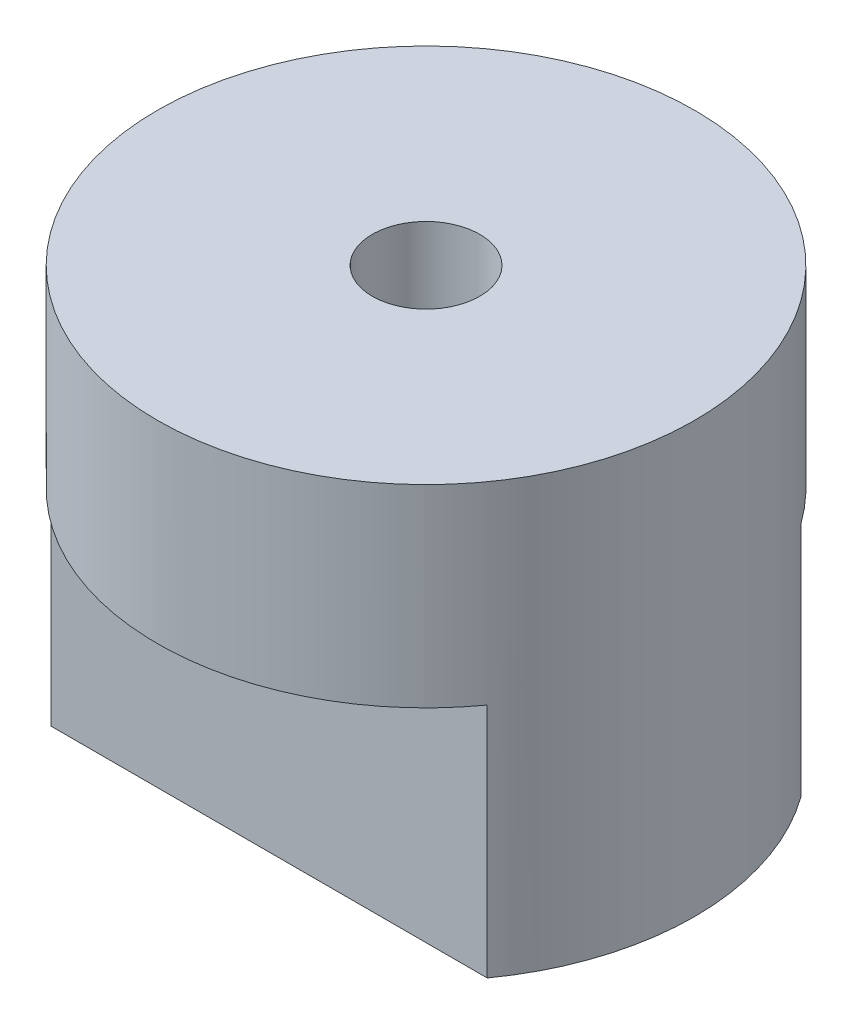
ISO-10303-21;
HEADER;
FILE_DESCRIPTION(('STEP AP214'),'2;1');
FILE_NAME('part.step','',(''),(''),'','','');
FILE_SCHEMA(('AUTOMOTIVE_DESIGN { 1 0 10303 214 1 1 1 1 }'));
ENDSEC;
DATA;
#1=APPLICATION_CONTEXT('core data for automotive mechanical design processes');
#2=APPLICATION_PROTOCOL_DEFINITION('international standard','automotive_design',2000,#1);
#3=PRODUCT_CONTEXT('',#1,'mechanical');
#4=PRODUCT('Part','Part','',(#3));
#5=PRODUCT_RELATED_PRODUCT_CATEGORY('part','',(#4));
#6=PRODUCT_DEFINITION_FORMATION('','',#4);
#7=PRODUCT_DEFINITION_CONTEXT('part definition',#1,'design');
#8=PRODUCT_DEFINITION('design','',#6,#7);
#9=PRODUCT_DEFINITION_SHAPE('','',#8);
#10=(LENGTH_UNIT() NAMED_UNIT(*) SI_UNIT(.MILLI.,.METRE.));
#11=(NAMED_UNIT(*) PLANE_ANGLE_UNIT() SI_UNIT($,.RADIAN.));
#12=(NAMED_UNIT(*) SI_UNIT($,.STERADIAN.) SOLID_ANGLE_UNIT());
#13=UNCERTAINTY_MEASURE_WITH_UNIT(LENGTH_MEASURE(1.E-05),#10,'distance_accuracy_value','');
#14=(GEOMETRIC_REPRESENTATION_CONTEXT(3) GLOBAL_UNCERTAINTY_ASSIGNED_CONTEXT((#13)) GLOBAL_UNIT_ASSIGNED_CONTEXT((#10,
#11,#12)) REPRESENTATION_CONTEXT('',''));
#15=CARTESIAN_POINT('',(0.,0.,0.));
#16=DIRECTION('',(0.,0.,1.));
#17=DIRECTION('',(1.,0.,0.));
#18=AXIS2_PLACEMENT_3D('',#15,#16,#17);
#19=CARTESIAN_POINT('',(0.,25.4,0.));
#20=DIRECTION('',(0.,-1.,0.));
#21=DIRECTION('',(0.,0.,-1.));
#22=AXIS2_PLACEMENT_3D('',#19,#20,#21);
#23=CYLINDRICAL_SURFACE('',#22,15.875);
#24=CARTESIAN_POINT('',(0.,25.4,0.));
#25=DIRECTION('',(0.,1.,0.));
#26=DIRECTION('',(0.,0.,1.));
#27=AXIS2_PLACEMENT_3D('',#24,#25,#26);
#28=CIRCLE('',#27,15.875);
#29=CARTESIAN_POINT('',(0.,25.4,15.875));
#30=VERTEX_POINT('',#29);
#31=EDGE_CURVE('E81',#30,#30,#28,.T.);
#32=ORIENTED_EDGE('',*,*,#31,.F.);
#33=EDGE_LOOP('',(#32));
#34=FACE_BOUND('',#33,.T.);
#35=CARTESIAN_POINT('',(0.,13.97,0.));
#36=DIRECTION('',(0.,1.,0.));
#37=DIRECTION('',(0.,0.,1.));
#38=AXIS2_PLACEMENT_3D('',#35,#36,#37);
#39=CIRCLE('',#38,15.875);
#40=CARTESIAN_POINT('',(-12.8865893082693,13.97,9.271));
#41=VERTEX_POINT('',#40);
#42=CARTESIAN_POINT('',(12.8865893082693,13.97,9.271));
#43=VERTEX_POINT('',#42);
#44=EDGE_CURVE('E11',#41,#43,#39,.T.);
#45=ORIENTED_EDGE('',*,*,#44,.T.);
#46=DIRECTION('',(0.,-1.,0.));
#47=VECTOR('',#46,1.);
#48=CARTESIAN_POINT('',(12.8865893082693,25.4,9.271));
#49=LINE('',#48,#47);
#50=CARTESIAN_POINT('',(12.8865893082693,0.,9.271));
#51=VERTEX_POINT('',#50);
#52=EDGE_CURVE('E90',#43,#51,#49,.T.);
#53=ORIENTED_EDGE('',*,*,#52,.T.);
#54=CARTESIAN_POINT('',(0.,0.,0.));
#55=DIRECTION('',(0.,1.,0.));
#56=DIRECTION('',(0.,0.,1.));
#57=AXIS2_PLACEMENT_3D('',#54,#55,#56);
#58=CIRCLE('',#57,15.875);
#59=CARTESIAN_POINT('',(12.8865893082693,0.,-9.271));
#60=VERTEX_POINT('',#59);
#61=EDGE_CURVE('E89',#51,#60,#58,.T.);
#62=ORIENTED_EDGE('',*,*,#61,.T.);
#63=DIRECTION('',(0.,-1.,0.));
#64=VECTOR('',#63,1.);
#65=CARTESIAN_POINT('',(12.8865893082693,25.4,-9.271));
#66=LINE('',#65,#64);
#67=CARTESIAN_POINT('',(12.8865893082693,13.97,-9.271));
#68=VERTEX_POINT('',#67);
#69=EDGE_CURVE('E55',#60,#68,#66,.F.);
#70=ORIENTED_EDGE('',*,*,#69,.T.);
#71=CARTESIAN_POINT('',(0.,13.97,0.));
#72=DIRECTION('',(0.,1.,0.));
#73=DIRECTION('',(0.,0.,1.));
#74=AXIS2_PLACEMENT_3D('',#71,#72,#73);
#75=CIRCLE('',#74,15.875);
#76=CARTESIAN_POINT('',(-12.8865893082693,13.97,-9.271));
#77=VERTEX_POINT('',#76);
#78=EDGE_CURVE('E40',#68,#77,#75,.T.);
#79=ORIENTED_EDGE('',*,*,#78,.T.);
#80=DIRECTION('',(0.,-1.,0.));
#81=VECTOR('',#80,1.);
#82=CARTESIAN_POINT('',(-12.8865893082693,25.4,-9.271));
#83=LINE('',#82,#81);
#84=CARTESIAN_POINT('',(-12.8865893082693,0.,-9.271));
#85=VERTEX_POINT('',#84);
#86=EDGE_CURVE('E74',#77,#85,#83,.T.);
#87=ORIENTED_EDGE('',*,*,#86,.T.);
#88=CARTESIAN_POINT('',(-12.8865893082693,0.,9.271));
#89=VERTEX_POINT('',#88);
#90=EDGE_CURVE('E86',#85,#89,#58,.T.);
#91=ORIENTED_EDGE('',*,*,#90,.T.);
#92=DIRECTION('',(0.,-1.,0.));
#93=VECTOR('',#92,1.);
#94=CARTESIAN_POINT('',(-12.8865893082693,25.4,9.271));
#95=LINE('',#94,#93);
#96=EDGE_CURVE('E47',#89,#41,#95,.F.);
#97=ORIENTED_EDGE('',*,*,#96,.T.);
#98=EDGE_LOOP('',(#45,#53,#62,#70,#79,#87,#91,#97));
#99=FACE_BOUND('',#98,.T.);
#100=ADVANCED_FACE('F33',(#34,#99),#23,.T.);
#101=CARTESIAN_POINT('',(0.,25.4,0.));
#102=DIRECTION('',(0.,1.,0.));
#103=DIRECTION('',(0.,0.,1.));
#104=AXIS2_PLACEMENT_3D('',#101,#102,#103);
#105=PLANE('',#104);
#106=CARTESIAN_POINT('',(0.,25.4,0.));
#107=DIRECTION('',(0.,1.,0.));
#108=DIRECTION('',(0.,0.,1.));
#109=AXIS2_PLACEMENT_3D('',#106,#107,#108);
#110=CIRCLE('',#109,3.175);
#111=CARTESIAN_POINT('',(0.,25.4,3.175));
#112=VERTEX_POINT('',#111);
#113=EDGE_CURVE('E106',#112,#112,#110,.T.);
#114=ORIENTED_EDGE('',*,*,#113,.F.);
#115=EDGE_LOOP('',(#114));
#116=FACE_BOUND('',#115,.T.);
#117=ORIENTED_EDGE('',*,*,#31,.T.);
#118=EDGE_LOOP('',(#117));
#119=FACE_BOUND('',#118,.T.);
#120=ADVANCED_FACE('F121',(#116,#119),#105,.T.);
#121=CARTESIAN_POINT('',(0.,0.,0.));
#122=DIRECTION('',(0.,1.,0.));
#123=DIRECTION('',(0.,0.,1.));
#124=AXIS2_PLACEMENT_3D('',#121,#122,#123);
#125=PLANE('',#124);
#126=ORIENTED_EDGE('',*,*,#61,.F.);
#127=DIRECTION('',(-1.,0.,0.));
#128=VECTOR('',#127,1.);
#129=CARTESIAN_POINT('',(0.,0.,9.271));
#130=LINE('',#129,#128);
#131=EDGE_CURVE('E80',#51,#89,#130,.T.);
#132=ORIENTED_EDGE('',*,*,#131,.T.);
#133=ORIENTED_EDGE('',*,*,#90,.F.);
#134=DIRECTION('',(1.,0.,0.));
#135=VECTOR('',#134,1.);
#136=CARTESIAN_POINT('',(0.,0.,-9.271));
#137=LINE('',#136,#135);
#138=EDGE_CURVE('E71',#85,#60,#137,.T.);
#139=ORIENTED_EDGE('',*,*,#138,.T.);
#140=EDGE_LOOP('',(#126,#132,#133,#139));
#141=FACE_BOUND('',#140,.T.);
#142=ADVANCED_FACE('F88',(#141),#125,.F.);
#143=CARTESIAN_POINT('',(-15.875,13.97,-15.875));
#144=DIRECTION('',(0.,1.,0.));
#145=DIRECTION('',(0.,0.,1.));
#146=AXIS2_PLACEMENT_3D('',#143,#144,#145);
#147=PLANE('',#146);
#148=DIRECTION('',(1.,0.,0.));
#149=VECTOR('',#148,1.);
#150=CARTESIAN_POINT('',(-15.875,13.97,-9.271));
#151=LINE('',#150,#149);
#152=EDGE_CURVE('E101',#77,#68,#151,.T.);
#153=ORIENTED_EDGE('',*,*,#152,.F.);
#154=ORIENTED_EDGE('',*,*,#78,.F.);
#155=EDGE_LOOP('',(#153,#154));
#156=FACE_BOUND('',#155,.T.);
#157=ADVANCED_FACE('F142',(#156),#147,.F.);
#158=CARTESIAN_POINT('',(-15.875,0.,-9.271));
#159=DIRECTION('',(0.,0.,1.));
#160=DIRECTION('',(1.,0.,0.));
#161=AXIS2_PLACEMENT_3D('',#158,#159,#160);
#162=PLANE('',#161);
#163=ORIENTED_EDGE('',*,*,#152,.T.);
#164=ORIENTED_EDGE('',*,*,#69,.F.);
#165=ORIENTED_EDGE('',*,*,#138,.F.);
#166=ORIENTED_EDGE('',*,*,#86,.F.);
#167=EDGE_LOOP('',(#163,#164,#165,#166));
#168=FACE_BOUND('',#167,.T.);
#169=ADVANCED_FACE('F73',(#168),#162,.F.);
#170=CARTESIAN_POINT('',(-15.875,13.97,15.875));
#171=DIRECTION('',(0.,1.,0.));
#172=DIRECTION('',(0.,0.,1.));
#173=AXIS2_PLACEMENT_3D('',#170,#171,#172);
#174=PLANE('',#173);
#175=ORIENTED_EDGE('',*,*,#44,.F.);
#176=DIRECTION('',(1.,0.,0.));
#177=VECTOR('',#176,1.);
#178=CARTESIAN_POINT('',(-15.875,13.97,9.271));
#179=LINE('',#178,#177);
#180=EDGE_CURVE('E100',#41,#43,#179,.T.);
#181=ORIENTED_EDGE('',*,*,#180,.T.);
#182=EDGE_LOOP('',(#175,#181));
#183=FACE_BOUND('',#182,.T.);
#184=ADVANCED_FACE('F155',(#183),#174,.F.);
#185=CARTESIAN_POINT('',(-15.875,0.,9.271));
#186=DIRECTION('',(0.,0.,-1.));
#187=DIRECTION('',(-1.,0.,0.));
#188=AXIS2_PLACEMENT_3D('',#185,#186,#187);
#189=PLANE('',#188);
#190=ORIENTED_EDGE('',*,*,#180,.F.);
#191=ORIENTED_EDGE('',*,*,#96,.F.);
#192=ORIENTED_EDGE('',*,*,#131,.F.);
#193=ORIENTED_EDGE('',*,*,#52,.F.);
#194=EDGE_LOOP('',(#190,#191,#192,#193));
#195=FACE_BOUND('',#194,.T.);
#196=ADVANCED_FACE('F117',(#195),#189,.F.);
#197=CARTESIAN_POINT('',(0.,12.7,0.));
#198=DIRECTION('',(0.,1.,0.));
#199=DIRECTION('',(0.,0.,1.));
#200=AXIS2_PLACEMENT_3D('',#197,#198,#199);
#201=CYLINDRICAL_SURFACE('',#200,3.175);
#202=CARTESIAN_POINT('',(0.,12.7,0.));
#203=DIRECTION('',(0.,1.,0.));
#204=DIRECTION('',(0.,0.,1.));
#205=AXIS2_PLACEMENT_3D('',#202,#203,#204);
#206=CIRCLE('',#205,3.175);
#207=CARTESIAN_POINT('',(0.,12.7,3.175));
#208=VERTEX_POINT('',#207);
#209=EDGE_CURVE('E103',#208,#208,#206,.T.);
#210=ORIENTED_EDGE('',*,*,#209,.F.);
#211=EDGE_LOOP('',(#210));
#212=FACE_BOUND('',#211,.T.);
#213=ORIENTED_EDGE('',*,*,#113,.T.);
#214=EDGE_LOOP('',(#213));
#215=FACE_BOUND('',#214,.T.);
#216=ADVANCED_FACE('F114',(#212,#215),#201,.F.);
#217=CARTESIAN_POINT('',(0.,12.7,0.));
#218=DIRECTION('',(0.,1.,0.));
#219=DIRECTION('',(0.,0.,1.));
#220=AXIS2_PLACEMENT_3D('',#217,#218,#219);
#221=PLANE('',#220);
#222=ORIENTED_EDGE('',*,*,#209,.T.);
#223=EDGE_LOOP('',(#222));
#224=FACE_BOUND('',#223,.T.);
#225=ADVANCED_FACE('F112',(#224),#221,.T.);
#226=CLOSED_SHELL('',(#100,#120,#142,#157,#169,#184,#196,#216,#225));
#227=MANIFOLD_SOLID_BREP('B2',#226);
#228=ADVANCED_BREP_SHAPE_REPRESENTATION('',(#18,#227),#14);
#229=SHAPE_DEFINITION_REPRESENTATION(#9,#228);
ENDSEC;
END-ISO-10303-21;
